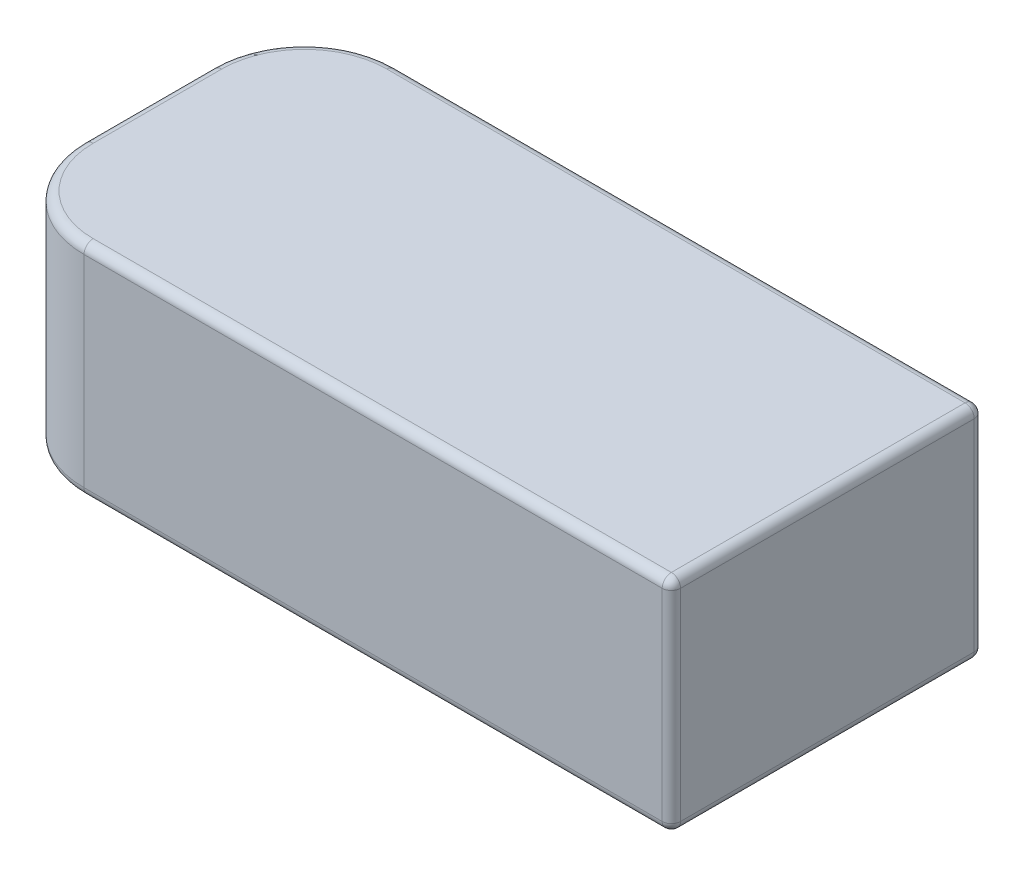
ISO-10303-21;
HEADER;
FILE_DESCRIPTION(('STEP AP214'),'2;1');
FILE_NAME('part.step','',(''),(''),'','','');
FILE_SCHEMA(('AUTOMOTIVE_DESIGN { 1 0 10303 214 1 1 1 1 }'));
ENDSEC;
DATA;
#1=APPLICATION_CONTEXT('core data for automotive mechanical design processes');
#2=APPLICATION_PROTOCOL_DEFINITION('international standard','automotive_design',2000,#1);
#3=PRODUCT_CONTEXT('',#1,'mechanical');
#4=PRODUCT('Part','Part','',(#3));
#5=PRODUCT_RELATED_PRODUCT_CATEGORY('part','',(#4));
#6=PRODUCT_DEFINITION_FORMATION('','',#4);
#7=PRODUCT_DEFINITION_CONTEXT('part definition',#1,'design');
#8=PRODUCT_DEFINITION('design','',#6,#7);
#9=PRODUCT_DEFINITION_SHAPE('','',#8);
#10=(LENGTH_UNIT() NAMED_UNIT(*) SI_UNIT(.MILLI.,.METRE.));
#11=(NAMED_UNIT(*) PLANE_ANGLE_UNIT() SI_UNIT($,.RADIAN.));
#12=(NAMED_UNIT(*) SI_UNIT($,.STERADIAN.) SOLID_ANGLE_UNIT());
#13=UNCERTAINTY_MEASURE_WITH_UNIT(LENGTH_MEASURE(1.E-05),#10,'distance_accuracy_value','');
#14=(GEOMETRIC_REPRESENTATION_CONTEXT(3) GLOBAL_UNCERTAINTY_ASSIGNED_CONTEXT((#13)) GLOBAL_UNIT_ASSIGNED_CONTEXT((#10,
#11,#12)) REPRESENTATION_CONTEXT('',''));
#15=CARTESIAN_POINT('',(0.,0.,0.));
#16=DIRECTION('',(0.,0.,1.));
#17=DIRECTION('',(1.,0.,0.));
#18=AXIS2_PLACEMENT_3D('',#15,#16,#17);
#19=CARTESIAN_POINT('',(37.,24.,17.));
#20=DIRECTION('',(-1.,0.,0.));
#21=DIRECTION('',(0.,0.,1.));
#22=AXIS2_PLACEMENT_3D('',#19,#20,#21);
#23=PLANE('',#22);
#24=DIRECTION('',(0.,0.,-1.));
#25=VECTOR('',#24,1.);
#26=CARTESIAN_POINT('',(37.,23.,17.));
#27=LINE('',#26,#25);
#28=CARTESIAN_POINT('',(37.,23.,-16.));
#29=VERTEX_POINT('',#28);
#30=CARTESIAN_POINT('',(37.,23.,16.));
#31=VERTEX_POINT('',#30);
#32=EDGE_CURVE('E179',#29,#31,#27,.F.);
#33=ORIENTED_EDGE('',*,*,#32,.T.);
#34=DIRECTION('',(0.,-1.,0.));
#35=VECTOR('',#34,1.);
#36=CARTESIAN_POINT('',(37.,24.,16.));
#37=LINE('',#36,#35);
#38=CARTESIAN_POINT('',(37.,1.,16.));
#39=VERTEX_POINT('',#38);
#40=EDGE_CURVE('E184',#31,#39,#37,.T.);
#41=ORIENTED_EDGE('',*,*,#40,.T.);
#42=DIRECTION('',(0.,0.,-1.));
#43=VECTOR('',#42,1.);
#44=CARTESIAN_POINT('',(37.,1.,-17.));
#45=LINE('',#44,#43);
#46=CARTESIAN_POINT('',(37.,1.,-16.));
#47=VERTEX_POINT('',#46);
#48=EDGE_CURVE('E181',#39,#47,#45,.T.);
#49=ORIENTED_EDGE('',*,*,#48,.T.);
#50=DIRECTION('',(0.,-1.,0.));
#51=VECTOR('',#50,1.);
#52=CARTESIAN_POINT('',(37.,24.,-16.));
#53=LINE('',#52,#51);
#54=EDGE_CURVE('E177',#47,#29,#53,.F.);
#55=ORIENTED_EDGE('',*,*,#54,.T.);
#56=EDGE_LOOP('',(#33,#41,#49,#55));
#57=FACE_BOUND('',#56,.T.);
#58=ADVANCED_FACE('F36',(#57),#23,.F.);
#59=CARTESIAN_POINT('',(-37.,24.,-17.));
#60=DIRECTION('',(0.,0.,1.));
#61=DIRECTION('',(1.,0.,0.));
#62=AXIS2_PLACEMENT_3D('',#59,#60,#61);
#63=PLANE('',#62);
#64=DIRECTION('',(0.,-1.,0.));
#65=VECTOR('',#64,1.);
#66=CARTESIAN_POINT('',(36.,24.,-17.));
#67=LINE('',#66,#65);
#68=CARTESIAN_POINT('',(36.,23.,-17.));
#69=VERTEX_POINT('',#68);
#70=CARTESIAN_POINT('',(36.,1.,-17.));
#71=VERTEX_POINT('',#70);
#72=EDGE_CURVE('E186',#69,#71,#67,.T.);
#73=ORIENTED_EDGE('',*,*,#72,.T.);
#74=DIRECTION('',(-1.,0.,0.));
#75=VECTOR('',#74,1.);
#76=CARTESIAN_POINT('',(-27.,1.,-17.));
#77=LINE('',#76,#75);
#78=CARTESIAN_POINT('',(-27.,1.,-17.));
#79=VERTEX_POINT('',#78);
#80=EDGE_CURVE('E190',#71,#79,#77,.T.);
#81=ORIENTED_EDGE('',*,*,#80,.T.);
#82=DIRECTION('',(0.,-1.,0.));
#83=VECTOR('',#82,1.);
#84=CARTESIAN_POINT('',(-27.,24.,-17.));
#85=LINE('',#84,#83);
#86=CARTESIAN_POINT('',(-27.,23.,-17.));
#87=VERTEX_POINT('',#86);
#88=EDGE_CURVE('E270',#79,#87,#85,.F.);
#89=ORIENTED_EDGE('',*,*,#88,.T.);
#90=DIRECTION('',(-1.,0.,0.));
#91=VECTOR('',#90,1.);
#92=CARTESIAN_POINT('',(-37.,23.,-17.));
#93=LINE('',#92,#91);
#94=EDGE_CURVE('E188',#87,#69,#93,.F.);
#95=ORIENTED_EDGE('',*,*,#94,.T.);
#96=EDGE_LOOP('',(#73,#81,#89,#95));
#97=FACE_BOUND('',#96,.T.);
#98=ADVANCED_FACE('F337',(#97),#63,.F.);
#99=CARTESIAN_POINT('',(-37.,24.,17.));
#100=DIRECTION('',(1.,0.,0.));
#101=DIRECTION('',(0.,0.,-1.));
#102=AXIS2_PLACEMENT_3D('',#99,#100,#101);
#103=PLANE('',#102);
#104=DIRECTION('',(0.,-1.,0.));
#105=VECTOR('',#104,1.);
#106=CARTESIAN_POINT('',(-37.,24.,-7.));
#107=LINE('',#106,#105);
#108=CARTESIAN_POINT('',(-37.,23.,-7.));
#109=VERTEX_POINT('',#108);
#110=CARTESIAN_POINT('',(-37.,1.,-7.));
#111=VERTEX_POINT('',#110);
#112=EDGE_CURVE('E265',#109,#111,#107,.T.);
#113=ORIENTED_EDGE('',*,*,#112,.T.);
#114=DIRECTION('',(0.,0.,1.));
#115=VECTOR('',#114,1.);
#116=CARTESIAN_POINT('',(-37.,1.,7.));
#117=LINE('',#116,#115);
#118=CARTESIAN_POINT('',(-37.,1.,7.));
#119=VERTEX_POINT('',#118);
#120=EDGE_CURVE('E198',#111,#119,#117,.T.);
#121=ORIENTED_EDGE('',*,*,#120,.T.);
#122=DIRECTION('',(0.,-1.,0.));
#123=VECTOR('',#122,1.);
#124=CARTESIAN_POINT('',(-37.,24.,7.));
#125=LINE('',#124,#123);
#126=CARTESIAN_POINT('',(-37.,23.,7.));
#127=VERTEX_POINT('',#126);
#128=EDGE_CURVE('E259',#119,#127,#125,.F.);
#129=ORIENTED_EDGE('',*,*,#128,.T.);
#130=DIRECTION('',(0.,0.,1.));
#131=VECTOR('',#130,1.);
#132=CARTESIAN_POINT('',(-37.,23.,17.));
#133=LINE('',#132,#131);
#134=EDGE_CURVE('E196',#127,#109,#133,.F.);
#135=ORIENTED_EDGE('',*,*,#134,.T.);
#136=EDGE_LOOP('',(#113,#121,#129,#135));
#137=FACE_BOUND('',#136,.T.);
#138=ADVANCED_FACE('F342',(#137),#103,.F.);
#139=CARTESIAN_POINT('',(-37.,24.,17.));
#140=DIRECTION('',(0.,0.,-1.));
#141=DIRECTION('',(-1.,0.,0.));
#142=AXIS2_PLACEMENT_3D('',#139,#140,#141);
#143=PLANE('',#142);
#144=DIRECTION('',(0.,-1.,0.));
#145=VECTOR('',#144,1.);
#146=CARTESIAN_POINT('',(-27.,24.,17.));
#147=LINE('',#146,#145);
#148=CARTESIAN_POINT('',(-27.,23.,17.));
#149=VERTEX_POINT('',#148);
#150=CARTESIAN_POINT('',(-27.,1.,17.));
#151=VERTEX_POINT('',#150);
#152=EDGE_CURVE('E157',#149,#151,#147,.T.);
#153=ORIENTED_EDGE('',*,*,#152,.T.);
#154=DIRECTION('',(1.,0.,0.));
#155=VECTOR('',#154,1.);
#156=CARTESIAN_POINT('',(37.,1.,17.));
#157=LINE('',#156,#155);
#158=CARTESIAN_POINT('',(36.,1.,17.));
#159=VERTEX_POINT('',#158);
#160=EDGE_CURVE('E175',#151,#159,#157,.T.);
#161=ORIENTED_EDGE('',*,*,#160,.T.);
#162=DIRECTION('',(0.,-1.,0.));
#163=VECTOR('',#162,1.);
#164=CARTESIAN_POINT('',(36.,24.,17.));
#165=LINE('',#164,#163);
#166=CARTESIAN_POINT('',(36.,23.,17.));
#167=VERTEX_POINT('',#166);
#168=EDGE_CURVE('E171',#159,#167,#165,.F.);
#169=ORIENTED_EDGE('',*,*,#168,.T.);
#170=DIRECTION('',(1.,0.,0.));
#171=VECTOR('',#170,1.);
#172=CARTESIAN_POINT('',(-37.,23.,17.));
#173=LINE('',#172,#171);
#174=EDGE_CURVE('E173',#167,#149,#173,.F.);
#175=ORIENTED_EDGE('',*,*,#174,.T.);
#176=EDGE_LOOP('',(#153,#161,#169,#175));
#177=FACE_BOUND('',#176,.T.);
#178=ADVANCED_FACE('F298',(#177),#143,.F.);
#179=CARTESIAN_POINT('',(0.,24.,0.));
#180=DIRECTION('',(0.,-1.,0.));
#181=DIRECTION('',(0.,0.,-1.));
#182=AXIS2_PLACEMENT_3D('',#179,#180,#181);
#183=PLANE('',#182);
#184=DIRECTION('',(1.,0.,0.));
#185=VECTOR('',#184,1.);
#186=CARTESIAN_POINT('',(0.,24.,16.));
#187=LINE('',#186,#185);
#188=CARTESIAN_POINT('',(-27.,24.,16.));
#189=VERTEX_POINT('',#188);
#190=CARTESIAN_POINT('',(36.,24.,16.));
#191=VERTEX_POINT('',#190);
#192=EDGE_CURVE('E45',#189,#191,#187,.T.);
#193=ORIENTED_EDGE('',*,*,#192,.T.);
#194=DIRECTION('',(0.,0.,-1.));
#195=VECTOR('',#194,1.);
#196=CARTESIAN_POINT('',(36.,24.,0.));
#197=LINE('',#196,#195);
#198=CARTESIAN_POINT('',(36.,24.,-16.));
#199=VERTEX_POINT('',#198);
#200=EDGE_CURVE('E11',#191,#199,#197,.T.);
#201=ORIENTED_EDGE('',*,*,#200,.T.);
#202=DIRECTION('',(-1.,0.,0.));
#203=VECTOR('',#202,1.);
#204=CARTESIAN_POINT('',(0.,24.,-16.));
#205=LINE('',#204,#203);
#206=CARTESIAN_POINT('',(-27.,24.,-16.));
#207=VERTEX_POINT('',#206);
#208=EDGE_CURVE('E200',#199,#207,#205,.T.);
#209=ORIENTED_EDGE('',*,*,#208,.T.);
#210=CARTESIAN_POINT('',(-27.,24.,-7.));
#211=DIRECTION('',(0.,-1.,0.));
#212=DIRECTION('',(0.,0.,-1.));
#213=AXIS2_PLACEMENT_3D('',#210,#211,#212);
#214=CIRCLE('',#213,9.);
#215=CARTESIAN_POINT('',(-36.,24.,-7.));
#216=VERTEX_POINT('',#215);
#217=EDGE_CURVE('E202',#207,#216,#214,.F.);
#218=ORIENTED_EDGE('',*,*,#217,.T.);
#219=DIRECTION('',(0.,0.,1.));
#220=VECTOR('',#219,1.);
#221=CARTESIAN_POINT('',(-36.,24.,0.));
#222=LINE('',#221,#220);
#223=CARTESIAN_POINT('',(-36.,24.,7.));
#224=VERTEX_POINT('',#223);
#225=EDGE_CURVE('E204',#216,#224,#222,.T.);
#226=ORIENTED_EDGE('',*,*,#225,.T.);
#227=CARTESIAN_POINT('',(-27.,24.,7.));
#228=DIRECTION('',(0.,-1.,0.));
#229=DIRECTION('',(0.,0.,-1.));
#230=AXIS2_PLACEMENT_3D('',#227,#228,#229);
#231=CIRCLE('',#230,9.);
#232=EDGE_CURVE('E56',#224,#189,#231,.F.);
#233=ORIENTED_EDGE('',*,*,#232,.T.);
#234=EDGE_LOOP('',(#193,#201,#209,#218,#226,#233));
#235=FACE_BOUND('',#234,.T.);
#236=ADVANCED_FACE('F316',(#235),#183,.F.);
#237=CARTESIAN_POINT('',(0.,0.,0.));
#238=DIRECTION('',(0.,-1.,0.));
#239=DIRECTION('',(0.,0.,-1.));
#240=AXIS2_PLACEMENT_3D('',#237,#238,#239);
#241=PLANE('',#240);
#242=DIRECTION('',(1.,0.,0.));
#243=VECTOR('',#242,1.);
#244=CARTESIAN_POINT('',(-27.,0.,16.));
#245=LINE('',#244,#243);
#246=CARTESIAN_POINT('',(36.,0.,16.));
#247=VERTEX_POINT('',#246);
#248=CARTESIAN_POINT('',(-27.,0.,16.));
#249=VERTEX_POINT('',#248);
#250=EDGE_CURVE('E161',#247,#249,#245,.F.);
#251=ORIENTED_EDGE('',*,*,#250,.T.);
#252=CARTESIAN_POINT('',(-27.,0.,7.));
#253=DIRECTION('',(0.,-1.,0.));
#254=DIRECTION('',(0.,0.,-1.));
#255=AXIS2_PLACEMENT_3D('',#252,#253,#254);
#256=CIRCLE('',#255,9.);
#257=CARTESIAN_POINT('',(-36.,0.,7.));
#258=VERTEX_POINT('',#257);
#259=EDGE_CURVE('E142',#249,#258,#256,.T.);
#260=ORIENTED_EDGE('',*,*,#259,.T.);
#261=DIRECTION('',(0.,0.,1.));
#262=VECTOR('',#261,1.);
#263=CARTESIAN_POINT('',(-36.,0.,-7.));
#264=LINE('',#263,#262);
#265=CARTESIAN_POINT('',(-36.,0.,-7.));
#266=VERTEX_POINT('',#265);
#267=EDGE_CURVE('E150',#258,#266,#264,.F.);
#268=ORIENTED_EDGE('',*,*,#267,.T.);
#269=CARTESIAN_POINT('',(-27.,0.,-7.));
#270=DIRECTION('',(0.,-1.,0.));
#271=DIRECTION('',(0.,0.,-1.));
#272=AXIS2_PLACEMENT_3D('',#269,#270,#271);
#273=CIRCLE('',#272,9.);
#274=CARTESIAN_POINT('',(-27.,0.,-16.));
#275=VERTEX_POINT('',#274);
#276=EDGE_CURVE('E156',#266,#275,#273,.T.);
#277=ORIENTED_EDGE('',*,*,#276,.T.);
#278=DIRECTION('',(-1.,0.,0.));
#279=VECTOR('',#278,1.);
#280=CARTESIAN_POINT('',(37.,0.,-16.));
#281=LINE('',#280,#279);
#282=CARTESIAN_POINT('',(36.,0.,-16.));
#283=VERTEX_POINT('',#282);
#284=EDGE_CURVE('E278',#275,#283,#281,.F.);
#285=ORIENTED_EDGE('',*,*,#284,.T.);
#286=DIRECTION('',(0.,0.,-1.));
#287=VECTOR('',#286,1.);
#288=CARTESIAN_POINT('',(36.,0.,17.));
#289=LINE('',#288,#287);
#290=EDGE_CURVE('E166',#283,#247,#289,.F.);
#291=ORIENTED_EDGE('',*,*,#290,.T.);
#292=EDGE_LOOP('',(#251,#260,#268,#277,#285,#291));
#293=FACE_BOUND('',#292,.T.);
#294=ADVANCED_FACE('F159',(#293),#241,.T.);
#295=CARTESIAN_POINT('',(-27.,24.,-7.));
#296=DIRECTION('',(0.,-1.,0.));
#297=DIRECTION('',(0.,0.,-1.));
#298=AXIS2_PLACEMENT_3D('',#295,#296,#297);
#299=CYLINDRICAL_SURFACE('',#298,10.);
#300=ORIENTED_EDGE('',*,*,#88,.F.);
#301=CARTESIAN_POINT('',(-27.,1.,-7.));
#302=DIRECTION('',(0.,-1.,0.));
#303=DIRECTION('',(0.,0.,-1.));
#304=AXIS2_PLACEMENT_3D('',#301,#302,#303);
#305=CIRCLE('',#304,10.);
#306=EDGE_CURVE('E194',#79,#111,#305,.F.);
#307=ORIENTED_EDGE('',*,*,#306,.T.);
#308=ORIENTED_EDGE('',*,*,#112,.F.);
#309=CARTESIAN_POINT('',(-27.,23.,-7.));
#310=DIRECTION('',(0.,-1.,0.));
#311=DIRECTION('',(0.,0.,-1.));
#312=AXIS2_PLACEMENT_3D('',#309,#310,#311);
#313=CIRCLE('',#312,10.);
#314=EDGE_CURVE('E192',#109,#87,#313,.T.);
#315=ORIENTED_EDGE('',*,*,#314,.T.);
#316=EDGE_LOOP('',(#300,#307,#308,#315));
#317=FACE_BOUND('',#316,.T.);
#318=ADVANCED_FACE('F347',(#317),#299,.T.);
#319=CARTESIAN_POINT('',(-27.,24.,7.));
#320=DIRECTION('',(0.,-1.,0.));
#321=DIRECTION('',(0.,0.,-1.));
#322=AXIS2_PLACEMENT_3D('',#319,#320,#321);
#323=CYLINDRICAL_SURFACE('',#322,10.);
#324=ORIENTED_EDGE('',*,*,#128,.F.);
#325=CARTESIAN_POINT('',(-27.,1.,7.));
#326=DIRECTION('',(0.,-1.,0.));
#327=DIRECTION('',(0.,0.,-1.));
#328=AXIS2_PLACEMENT_3D('',#325,#326,#327);
#329=CIRCLE('',#328,10.);
#330=EDGE_CURVE('E144',#119,#151,#329,.F.);
#331=ORIENTED_EDGE('',*,*,#330,.T.);
#332=ORIENTED_EDGE('',*,*,#152,.F.);
#333=CARTESIAN_POINT('',(-27.,23.,7.));
#334=DIRECTION('',(0.,-1.,0.));
#335=DIRECTION('',(0.,0.,-1.));
#336=AXIS2_PLACEMENT_3D('',#333,#334,#335);
#337=CIRCLE('',#336,10.);
#338=EDGE_CURVE('E163',#149,#127,#337,.T.);
#339=ORIENTED_EDGE('',*,*,#338,.T.);
#340=EDGE_LOOP('',(#324,#331,#332,#339));
#341=FACE_BOUND('',#340,.T.);
#342=ADVANCED_FACE('F296',(#341),#323,.T.);
#343=CARTESIAN_POINT('',(-27.,23.,-7.));
#344=DIRECTION('',(0.,-1.,0.));
#345=DIRECTION('',(0.,0.,-1.));
#346=AXIS2_PLACEMENT_3D('',#343,#344,#345);
#347=TOROIDAL_SURFACE('',#346,9.,1.);
#348=CARTESIAN_POINT('',(-27.,23.,-16.));
#349=DIRECTION('',(1.,0.,0.));
#350=DIRECTION('',(0.,0.,-1.));
#351=AXIS2_PLACEMENT_3D('',#348,#349,#350);
#352=CIRCLE('',#351,1.);
#353=EDGE_CURVE('E252',#87,#207,#352,.T.);
#354=ORIENTED_EDGE('',*,*,#353,.F.);
#355=ORIENTED_EDGE('',*,*,#314,.F.);
#356=CARTESIAN_POINT('',(-36.,23.,-7.));
#357=DIRECTION('',(0.,0.,1.));
#358=DIRECTION('',(1.,0.,0.));
#359=AXIS2_PLACEMENT_3D('',#356,#357,#358);
#360=CIRCLE('',#359,1.);
#361=EDGE_CURVE('E40',#216,#109,#360,.T.);
#362=ORIENTED_EDGE('',*,*,#361,.F.);
#363=ORIENTED_EDGE('',*,*,#217,.F.);
#364=EDGE_LOOP('',(#354,#355,#362,#363));
#365=FACE_BOUND('',#364,.T.);
#366=ADVANCED_FACE('F38',(#365),#347,.T.);
#367=CARTESIAN_POINT('',(-36.,23.,0.));
#368=DIRECTION('',(0.,0.,1.));
#369=DIRECTION('',(1.,0.,0.));
#370=AXIS2_PLACEMENT_3D('',#367,#368,#369);
#371=CYLINDRICAL_SURFACE('',#370,1.);
#372=ORIENTED_EDGE('',*,*,#361,.T.);
#373=ORIENTED_EDGE('',*,*,#134,.F.);
#374=CARTESIAN_POINT('',(-36.,23.,7.));
#375=DIRECTION('',(0.,0.,1.));
#376=DIRECTION('',(1.,0.,0.));
#377=AXIS2_PLACEMENT_3D('',#374,#375,#376);
#378=CIRCLE('',#377,1.);
#379=EDGE_CURVE('E250',#224,#127,#378,.T.);
#380=ORIENTED_EDGE('',*,*,#379,.F.);
#381=ORIENTED_EDGE('',*,*,#225,.F.);
#382=EDGE_LOOP('',(#372,#373,#380,#381));
#383=FACE_BOUND('',#382,.T.);
#384=ADVANCED_FACE('F322',(#383),#371,.T.);
#385=CARTESIAN_POINT('',(0.,23.,-16.));
#386=DIRECTION('',(-1.,0.,0.));
#387=DIRECTION('',(0.,0.,1.));
#388=AXIS2_PLACEMENT_3D('',#385,#386,#387);
#389=CYLINDRICAL_SURFACE('',#388,1.);
#390=ORIENTED_EDGE('',*,*,#353,.T.);
#391=ORIENTED_EDGE('',*,*,#208,.F.);
#392=CARTESIAN_POINT('',(36.,23.,-16.));
#393=DIRECTION('',(1.,0.,0.));
#394=DIRECTION('',(0.,0.,-1.));
#395=AXIS2_PLACEMENT_3D('',#392,#393,#394);
#396=CIRCLE('',#395,1.);
#397=EDGE_CURVE('E247',#69,#199,#396,.T.);
#398=ORIENTED_EDGE('',*,*,#397,.F.);
#399=ORIENTED_EDGE('',*,*,#94,.F.);
#400=EDGE_LOOP('',(#390,#391,#398,#399));
#401=FACE_BOUND('',#400,.T.);
#402=ADVANCED_FACE('F327',(#401),#389,.T.);
#403=CARTESIAN_POINT('',(-27.,23.,7.));
#404=DIRECTION('',(0.,-1.,0.));
#405=DIRECTION('',(0.,0.,-1.));
#406=AXIS2_PLACEMENT_3D('',#403,#404,#405);
#407=TOROIDAL_SURFACE('',#406,9.,1.);
#408=ORIENTED_EDGE('',*,*,#379,.T.);
#409=ORIENTED_EDGE('',*,*,#338,.F.);
#410=CARTESIAN_POINT('',(-27.,23.,16.));
#411=DIRECTION('',(1.,0.,0.));
#412=DIRECTION('',(0.,0.,-1.));
#413=AXIS2_PLACEMENT_3D('',#410,#411,#412);
#414=CIRCLE('',#413,1.);
#415=EDGE_CURVE('E244',#189,#149,#414,.T.);
#416=ORIENTED_EDGE('',*,*,#415,.F.);
#417=ORIENTED_EDGE('',*,*,#232,.F.);
#418=EDGE_LOOP('',(#408,#409,#416,#417));
#419=FACE_BOUND('',#418,.T.);
#420=ADVANCED_FACE('F324',(#419),#407,.T.);
#421=CARTESIAN_POINT('',(36.,23.,-16.));
#422=DIRECTION('',(0.,1.,0.));
#423=DIRECTION('',(0.,0.,1.));
#424=AXIS2_PLACEMENT_3D('',#421,#422,#423);
#425=SPHERICAL_SURFACE('',#424,1.);
#426=CARTESIAN_POINT('',(36.,23.,-16.));
#427=DIRECTION('',(0.,1.,0.));
#428=DIRECTION('',(0.,0.,1.));
#429=AXIS2_PLACEMENT_3D('',#426,#427,#428);
#430=CIRCLE('',#429,1.);
#431=EDGE_CURVE('E239',#69,#29,#430,.F.);
#432=ORIENTED_EDGE('',*,*,#431,.F.);
#433=ORIENTED_EDGE('',*,*,#397,.T.);
#434=CARTESIAN_POINT('',(36.,23.,-16.));
#435=DIRECTION('',(0.,0.,-1.));
#436=DIRECTION('',(-1.,0.,0.));
#437=AXIS2_PLACEMENT_3D('',#434,#435,#436);
#438=CIRCLE('',#437,1.);
#439=EDGE_CURVE('E242',#29,#199,#438,.F.);
#440=ORIENTED_EDGE('',*,*,#439,.F.);
#441=EDGE_LOOP('',(#432,#433,#440));
#442=FACE_BOUND('',#441,.T.);
#443=ADVANCED_FACE('F326',(#442),#425,.T.);
#444=CARTESIAN_POINT('',(0.,23.,16.));
#445=DIRECTION('',(1.,0.,0.));
#446=DIRECTION('',(0.,0.,-1.));
#447=AXIS2_PLACEMENT_3D('',#444,#445,#446);
#448=CYLINDRICAL_SURFACE('',#447,1.);
#449=ORIENTED_EDGE('',*,*,#415,.T.);
#450=ORIENTED_EDGE('',*,*,#174,.F.);
#451=CARTESIAN_POINT('',(36.,23.,16.));
#452=DIRECTION('',(1.,0.,0.));
#453=DIRECTION('',(0.,0.,-1.));
#454=AXIS2_PLACEMENT_3D('',#451,#452,#453);
#455=CIRCLE('',#454,1.);
#456=EDGE_CURVE('E236',#191,#167,#455,.T.);
#457=ORIENTED_EDGE('',*,*,#456,.F.);
#458=ORIENTED_EDGE('',*,*,#192,.F.);
#459=EDGE_LOOP('',(#449,#450,#457,#458));
#460=FACE_BOUND('',#459,.T.);
#461=ADVANCED_FACE('F302',(#460),#448,.T.);
#462=CARTESIAN_POINT('',(36.,23.,0.));
#463=DIRECTION('',(0.,0.,-1.));
#464=DIRECTION('',(-1.,0.,0.));
#465=AXIS2_PLACEMENT_3D('',#462,#463,#464);
#466=CYLINDRICAL_SURFACE('',#465,1.);
#467=ORIENTED_EDGE('',*,*,#439,.T.);
#468=ORIENTED_EDGE('',*,*,#200,.F.);
#469=CARTESIAN_POINT('',(36.,23.,16.));
#470=DIRECTION('',(0.,0.,1.));
#471=DIRECTION('',(1.,0.,0.));
#472=AXIS2_PLACEMENT_3D('',#469,#470,#471);
#473=CIRCLE('',#472,1.);
#474=EDGE_CURVE('E233',#31,#191,#473,.T.);
#475=ORIENTED_EDGE('',*,*,#474,.F.);
#476=ORIENTED_EDGE('',*,*,#32,.F.);
#477=EDGE_LOOP('',(#467,#468,#475,#476));
#478=FACE_BOUND('',#477,.T.);
#479=ADVANCED_FACE('F314',(#478),#466,.T.);
#480=CARTESIAN_POINT('',(36.,24.,-16.));
#481=DIRECTION('',(0.,-1.,0.));
#482=DIRECTION('',(0.,0.,-1.));
#483=AXIS2_PLACEMENT_3D('',#480,#481,#482);
#484=CYLINDRICAL_SURFACE('',#483,1.);
#485=ORIENTED_EDGE('',*,*,#431,.T.);
#486=ORIENTED_EDGE('',*,*,#54,.F.);
#487=CARTESIAN_POINT('',(36.,1.,-16.));
#488=DIRECTION('',(0.,-1.,0.));
#489=DIRECTION('',(0.,0.,-1.));
#490=AXIS2_PLACEMENT_3D('',#487,#488,#489);
#491=CIRCLE('',#490,1.);
#492=EDGE_CURVE('E230',#71,#47,#491,.T.);
#493=ORIENTED_EDGE('',*,*,#492,.F.);
#494=ORIENTED_EDGE('',*,*,#72,.F.);
#495=EDGE_LOOP('',(#485,#486,#493,#494));
#496=FACE_BOUND('',#495,.T.);
#497=ADVANCED_FACE('F379',(#496),#484,.T.);
#498=CARTESIAN_POINT('',(36.,23.,16.));
#499=DIRECTION('',(0.,1.,0.));
#500=DIRECTION('',(0.,0.,1.));
#501=AXIS2_PLACEMENT_3D('',#498,#499,#500);
#502=SPHERICAL_SURFACE('',#501,1.);
#503=ORIENTED_EDGE('',*,*,#474,.T.);
#504=ORIENTED_EDGE('',*,*,#456,.T.);
#505=CARTESIAN_POINT('',(36.,23.,16.));
#506=DIRECTION('',(0.,1.,0.));
#507=DIRECTION('',(0.,0.,1.));
#508=AXIS2_PLACEMENT_3D('',#505,#506,#507);
#509=CIRCLE('',#508,1.);
#510=EDGE_CURVE('E227',#31,#167,#509,.F.);
#511=ORIENTED_EDGE('',*,*,#510,.F.);
#512=EDGE_LOOP('',(#503,#504,#511));
#513=FACE_BOUND('',#512,.T.);
#514=ADVANCED_FACE('F305',(#513),#502,.T.);
#515=CARTESIAN_POINT('',(36.,1.,-16.));
#516=DIRECTION('',(1.,0.,0.));
#517=DIRECTION('',(0.,1.,0.));
#518=AXIS2_PLACEMENT_3D('',#515,#516,#517);
#519=SPHERICAL_SURFACE('',#518,1.);
#520=CARTESIAN_POINT('',(36.,1.,-16.));
#521=DIRECTION('',(1.,0.,0.));
#522=DIRECTION('',(0.,0.,-1.));
#523=AXIS2_PLACEMENT_3D('',#520,#521,#522);
#524=CIRCLE('',#523,1.);
#525=EDGE_CURVE('E222',#71,#283,#524,.F.);
#526=ORIENTED_EDGE('',*,*,#525,.F.);
#527=ORIENTED_EDGE('',*,*,#492,.T.);
#528=CARTESIAN_POINT('',(36.,1.,-16.));
#529=DIRECTION('',(0.,0.,-1.));
#530=DIRECTION('',(-1.,0.,0.));
#531=AXIS2_PLACEMENT_3D('',#528,#529,#530);
#532=CIRCLE('',#531,1.);
#533=EDGE_CURVE('E225',#283,#47,#532,.F.);
#534=ORIENTED_EDGE('',*,*,#533,.F.);
#535=EDGE_LOOP('',(#526,#527,#534));
#536=FACE_BOUND('',#535,.T.);
#537=ADVANCED_FACE('F373',(#536),#519,.T.);
#538=CARTESIAN_POINT('',(36.,24.,16.));
#539=DIRECTION('',(0.,-1.,0.));
#540=DIRECTION('',(0.,0.,-1.));
#541=AXIS2_PLACEMENT_3D('',#538,#539,#540);
#542=CYLINDRICAL_SURFACE('',#541,1.);
#543=ORIENTED_EDGE('',*,*,#510,.T.);
#544=ORIENTED_EDGE('',*,*,#168,.F.);
#545=CARTESIAN_POINT('',(36.,1.,16.));
#546=DIRECTION('',(0.,-1.,0.));
#547=DIRECTION('',(0.,0.,-1.));
#548=AXIS2_PLACEMENT_3D('',#545,#546,#547);
#549=CIRCLE('',#548,1.);
#550=EDGE_CURVE('E219',#39,#159,#549,.T.);
#551=ORIENTED_EDGE('',*,*,#550,.F.);
#552=ORIENTED_EDGE('',*,*,#40,.F.);
#553=EDGE_LOOP('',(#543,#544,#551,#552));
#554=FACE_BOUND('',#553,.T.);
#555=ADVANCED_FACE('F309',(#554),#542,.T.);
#556=CARTESIAN_POINT('',(36.,1.,17.));
#557=DIRECTION('',(0.,0.,1.));
#558=DIRECTION('',(1.,0.,0.));
#559=AXIS2_PLACEMENT_3D('',#556,#557,#558);
#560=CYLINDRICAL_SURFACE('',#559,1.);
#561=ORIENTED_EDGE('',*,*,#533,.T.);
#562=ORIENTED_EDGE('',*,*,#48,.F.);
#563=CARTESIAN_POINT('',(36.,1.,16.));
#564=DIRECTION('',(0.,0.,1.));
#565=DIRECTION('',(1.,0.,0.));
#566=AXIS2_PLACEMENT_3D('',#563,#564,#565);
#567=CIRCLE('',#566,1.);
#568=EDGE_CURVE('E216',#247,#39,#567,.T.);
#569=ORIENTED_EDGE('',*,*,#568,.F.);
#570=ORIENTED_EDGE('',*,*,#290,.F.);
#571=EDGE_LOOP('',(#561,#562,#569,#570));
#572=FACE_BOUND('',#571,.T.);
#573=ADVANCED_FACE('F285',(#572),#560,.T.);
#574=CARTESIAN_POINT('',(-37.,1.,-16.));
#575=DIRECTION('',(1.,0.,0.));
#576=DIRECTION('',(0.,0.,-1.));
#577=AXIS2_PLACEMENT_3D('',#574,#575,#576);
#578=CYLINDRICAL_SURFACE('',#577,1.);
#579=ORIENTED_EDGE('',*,*,#525,.T.);
#580=ORIENTED_EDGE('',*,*,#284,.F.);
#581=CARTESIAN_POINT('',(-27.,1.,-16.));
#582=DIRECTION('',(-1.,0.,0.));
#583=DIRECTION('',(0.,0.,1.));
#584=AXIS2_PLACEMENT_3D('',#581,#582,#583);
#585=CIRCLE('',#584,1.);
#586=EDGE_CURVE('E213',#79,#275,#585,.T.);
#587=ORIENTED_EDGE('',*,*,#586,.F.);
#588=ORIENTED_EDGE('',*,*,#80,.F.);
#589=EDGE_LOOP('',(#579,#580,#587,#588));
#590=FACE_BOUND('',#589,.T.);
#591=ADVANCED_FACE('F365',(#590),#578,.T.);
#592=CARTESIAN_POINT('',(36.,1.,16.));
#593=DIRECTION('',(1.,0.,0.));
#594=DIRECTION('',(0.,1.,0.));
#595=AXIS2_PLACEMENT_3D('',#592,#593,#594);
#596=SPHERICAL_SURFACE('',#595,1.);
#597=ORIENTED_EDGE('',*,*,#568,.T.);
#598=ORIENTED_EDGE('',*,*,#550,.T.);
#599=CARTESIAN_POINT('',(36.,1.,16.));
#600=DIRECTION('',(1.,0.,0.));
#601=DIRECTION('',(0.,0.,-1.));
#602=AXIS2_PLACEMENT_3D('',#599,#600,#601);
#603=CIRCLE('',#602,1.);
#604=EDGE_CURVE('E210',#247,#159,#603,.F.);
#605=ORIENTED_EDGE('',*,*,#604,.F.);
#606=EDGE_LOOP('',(#597,#598,#605));
#607=FACE_BOUND('',#606,.T.);
#608=ADVANCED_FACE('F288',(#607),#596,.T.);
#609=CARTESIAN_POINT('',(-27.,1.,-7.));
#610=DIRECTION('',(0.,-1.,0.));
#611=DIRECTION('',(0.,0.,-1.));
#612=AXIS2_PLACEMENT_3D('',#609,#610,#611);
#613=TOROIDAL_SURFACE('',#612,9.,1.);
#614=ORIENTED_EDGE('',*,*,#586,.T.);
#615=ORIENTED_EDGE('',*,*,#276,.F.);
#616=CARTESIAN_POINT('',(-36.,1.,-7.));
#617=DIRECTION('',(0.,0.,1.));
#618=DIRECTION('',(1.,0.,0.));
#619=AXIS2_PLACEMENT_3D('',#616,#617,#618);
#620=CIRCLE('',#619,1.);
#621=EDGE_CURVE('E153',#111,#266,#620,.T.);
#622=ORIENTED_EDGE('',*,*,#621,.F.);
#623=ORIENTED_EDGE('',*,*,#306,.F.);
#624=EDGE_LOOP('',(#614,#615,#622,#623));
#625=FACE_BOUND('',#624,.T.);
#626=ADVANCED_FACE('F359',(#625),#613,.T.);
#627=CARTESIAN_POINT('',(-37.,1.,16.));
#628=DIRECTION('',(-1.,0.,0.));
#629=DIRECTION('',(0.,0.,1.));
#630=AXIS2_PLACEMENT_3D('',#627,#628,#629);
#631=CYLINDRICAL_SURFACE('',#630,1.);
#632=ORIENTED_EDGE('',*,*,#604,.T.);
#633=ORIENTED_EDGE('',*,*,#160,.F.);
#634=CARTESIAN_POINT('',(-27.,1.,16.));
#635=DIRECTION('',(-1.,0.,0.));
#636=DIRECTION('',(0.,0.,1.));
#637=AXIS2_PLACEMENT_3D('',#634,#635,#636);
#638=CIRCLE('',#637,1.);
#639=EDGE_CURVE('E147',#249,#151,#638,.T.);
#640=ORIENTED_EDGE('',*,*,#639,.F.);
#641=ORIENTED_EDGE('',*,*,#250,.F.);
#642=EDGE_LOOP('',(#632,#633,#640,#641));
#643=FACE_BOUND('',#642,.T.);
#644=ADVANCED_FACE('F291',(#643),#631,.T.);
#645=CARTESIAN_POINT('',(-36.,1.,17.));
#646=DIRECTION('',(0.,0.,-1.));
#647=DIRECTION('',(-1.,0.,0.));
#648=AXIS2_PLACEMENT_3D('',#645,#646,#647);
#649=CYLINDRICAL_SURFACE('',#648,1.);
#650=ORIENTED_EDGE('',*,*,#621,.T.);
#651=ORIENTED_EDGE('',*,*,#267,.F.);
#652=CARTESIAN_POINT('',(-36.,1.,7.));
#653=DIRECTION('',(0.,0.,1.));
#654=DIRECTION('',(1.,0.,0.));
#655=AXIS2_PLACEMENT_3D('',#652,#653,#654);
#656=CIRCLE('',#655,1.);
#657=EDGE_CURVE('E138',#119,#258,#656,.T.);
#658=ORIENTED_EDGE('',*,*,#657,.F.);
#659=ORIENTED_EDGE('',*,*,#120,.F.);
#660=EDGE_LOOP('',(#650,#651,#658,#659));
#661=FACE_BOUND('',#660,.T.);
#662=ADVANCED_FACE('F151',(#661),#649,.T.);
#663=CARTESIAN_POINT('',(-27.,1.,7.));
#664=DIRECTION('',(0.,-1.,0.));
#665=DIRECTION('',(0.,0.,-1.));
#666=AXIS2_PLACEMENT_3D('',#663,#664,#665);
#667=TOROIDAL_SURFACE('',#666,9.,1.);
#668=ORIENTED_EDGE('',*,*,#639,.T.);
#669=ORIENTED_EDGE('',*,*,#330,.F.);
#670=ORIENTED_EDGE('',*,*,#657,.T.);
#671=ORIENTED_EDGE('',*,*,#259,.F.);
#672=EDGE_LOOP('',(#668,#669,#670,#671));
#673=FACE_BOUND('',#672,.T.);
#674=ADVANCED_FACE('F140',(#673),#667,.T.);
#675=CLOSED_SHELL('',(#58,#98,#138,#178,#236,#294,#318,#342,#366,#384,#402,#420,#443,#461,#479,
#497,#514,#537,#555,#573,#591,#608,#626,#644,#662,#674));
#676=MANIFOLD_SOLID_BREP('B2',#675);
#677=ADVANCED_BREP_SHAPE_REPRESENTATION('',(#18,#676),#14);
#678=SHAPE_DEFINITION_REPRESENTATION(#9,#677);
ENDSEC;
END-ISO-10303-21;
